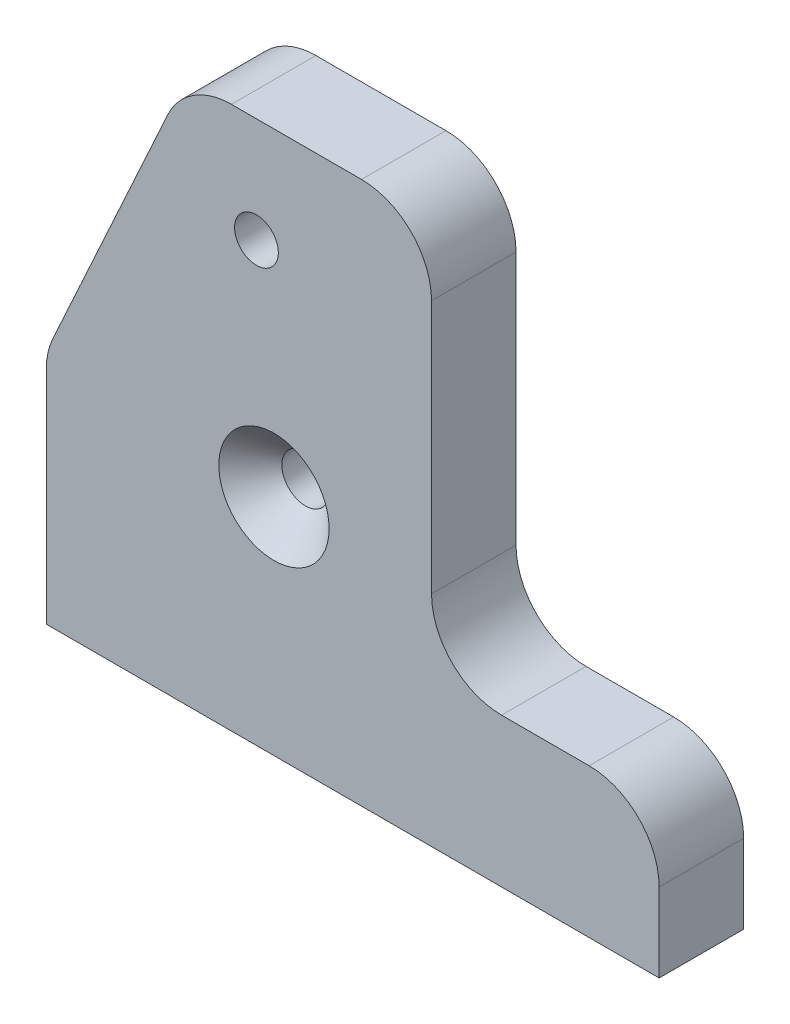
ISO-10303-21;
HEADER;
FILE_DESCRIPTION(('STEP AP214'),'2;1');
FILE_NAME('part.step','',(''),(''),'','','');
FILE_SCHEMA(('AUTOMOTIVE_DESIGN { 1 0 10303 214 1 1 1 1 }'));
ENDSEC;
DATA;
#1=APPLICATION_CONTEXT('core data for automotive mechanical design processes');
#2=APPLICATION_PROTOCOL_DEFINITION('international standard','automotive_design',2000,#1);
#3=PRODUCT_CONTEXT('',#1,'mechanical');
#4=PRODUCT('Part','Part','',(#3));
#5=PRODUCT_RELATED_PRODUCT_CATEGORY('part','',(#4));
#6=PRODUCT_DEFINITION_FORMATION('','',#4);
#7=PRODUCT_DEFINITION_CONTEXT('part definition',#1,'design');
#8=PRODUCT_DEFINITION('design','',#6,#7);
#9=PRODUCT_DEFINITION_SHAPE('','',#8);
#10=(LENGTH_UNIT() NAMED_UNIT(*) SI_UNIT(.MILLI.,.METRE.));
#11=(NAMED_UNIT(*) PLANE_ANGLE_UNIT() SI_UNIT($,.RADIAN.));
#12=(NAMED_UNIT(*) SI_UNIT($,.STERADIAN.) SOLID_ANGLE_UNIT());
#13=UNCERTAINTY_MEASURE_WITH_UNIT(LENGTH_MEASURE(1.E-05),#10,'distance_accuracy_value','');
#14=(GEOMETRIC_REPRESENTATION_CONTEXT(3) GLOBAL_UNCERTAINTY_ASSIGNED_CONTEXT((#13)) GLOBAL_UNIT_ASSIGNED_CONTEXT((#10,
#11,#12)) REPRESENTATION_CONTEXT('',''));
#15=CARTESIAN_POINT('',(0.,0.,0.));
#16=DIRECTION('',(0.,0.,1.));
#17=DIRECTION('',(1.,0.,0.));
#18=AXIS2_PLACEMENT_3D('',#15,#16,#17);
#19=CARTESIAN_POINT('',(0.,31.,4.826));
#20=DIRECTION('',(0.,1.,0.));
#21=DIRECTION('',(-1.,0.,0.));
#22=AXIS2_PLACEMENT_3D('',#19,#20,#21);
#23=PLANE('',#22);
#24=DIRECTION('',(1.,0.,0.));
#25=VECTOR('',#24,1.);
#26=CARTESIAN_POINT('',(0.,31.,0.));
#27=LINE('',#26,#25);
#28=CARTESIAN_POINT('',(10.5695728925472,31.,0.));
#29=VERTEX_POINT('',#28);
#30=CARTESIAN_POINT('',(18.,31.,0.));
#31=VERTEX_POINT('',#30);
#32=EDGE_CURVE('E180',#29,#31,#27,.T.);
#33=ORIENTED_EDGE('',*,*,#32,.F.);
#34=DIRECTION('',(0.,0.,-1.));
#35=VECTOR('',#34,1.);
#36=CARTESIAN_POINT('',(10.5695728925472,31.,4.826));
#37=LINE('',#36,#35);
#38=CARTESIAN_POINT('',(10.5695728925472,31.,4.826));
#39=VERTEX_POINT('',#38);
#40=EDGE_CURVE('E279',#29,#39,#37,.F.);
#41=ORIENTED_EDGE('',*,*,#40,.T.);
#42=DIRECTION('',(1.,0.,0.));
#43=VECTOR('',#42,1.);
#44=CARTESIAN_POINT('',(0.,31.,4.826));
#45=LINE('',#44,#43);
#46=CARTESIAN_POINT('',(18.,31.,4.826));
#47=VERTEX_POINT('',#46);
#48=EDGE_CURVE('E181',#39,#47,#45,.T.);
#49=ORIENTED_EDGE('',*,*,#48,.T.);
#50=DIRECTION('',(0.,0.,-1.));
#51=VECTOR('',#50,1.);
#52=CARTESIAN_POINT('',(18.,31.,4.826));
#53=LINE('',#52,#51);
#54=EDGE_CURVE('E275',#47,#31,#53,.T.);
#55=ORIENTED_EDGE('',*,*,#54,.T.);
#56=EDGE_LOOP('',(#33,#41,#49,#55));
#57=FACE_BOUND('',#56,.T.);
#58=ADVANCED_FACE('F51',(#57),#23,.T.);
#59=CARTESIAN_POINT('',(-5.10465901417961,2.33355840648211,4.826));
#60=DIRECTION('',(0.9094744755858,-0.415759760267795,0.));
#61=DIRECTION('',(0.415759760267795,0.9094744755858,0.));
#62=AXIS2_PLACEMENT_3D('',#59,#60,#61);
#63=PLANE('',#62);
#64=DIRECTION('',(-0.415759760267795,-0.9094744755858,0.));
#65=VECTOR('',#64,1.);
#66=CARTESIAN_POINT('',(-5.10465901417961,2.33355840648211,0.));
#67=LINE('',#66,#65);
#68=CARTESIAN_POINT('',(6.93167499020397,28.6630390410712,0.));
#69=VERTEX_POINT('',#68);
#70=CARTESIAN_POINT('',(0.3621020976568,14.2920983386242,0.));
#71=VERTEX_POINT('',#70);
#72=EDGE_CURVE('E212',#69,#71,#67,.T.);
#73=ORIENTED_EDGE('',*,*,#72,.T.);
#74=DIRECTION('',(0.,0.,-1.));
#75=VECTOR('',#74,1.);
#76=CARTESIAN_POINT('',(0.362102097656799,14.2920983386242,4.826));
#77=LINE('',#76,#75);
#78=CARTESIAN_POINT('',(0.3621020976568,14.2920983386242,4.826));
#79=VERTEX_POINT('',#78);
#80=EDGE_CURVE('E260',#71,#79,#77,.F.);
#81=ORIENTED_EDGE('',*,*,#80,.T.);
#82=DIRECTION('',(-0.415759760267795,-0.9094744755858,0.));
#83=VECTOR('',#82,1.);
#84=CARTESIAN_POINT('',(-5.10465901417961,2.33355840648211,4.826));
#85=LINE('',#84,#83);
#86=CARTESIAN_POINT('',(6.93167499020397,28.6630390410712,4.826));
#87=VERTEX_POINT('',#86);
#88=EDGE_CURVE('E185',#87,#79,#85,.T.);
#89=ORIENTED_EDGE('',*,*,#88,.F.);
#90=DIRECTION('',(0.,0.,-1.));
#91=VECTOR('',#90,1.);
#92=CARTESIAN_POINT('',(6.93167499020397,28.6630390410712,0.));
#93=LINE('',#92,#91);
#94=EDGE_CURVE('E256',#87,#69,#93,.T.);
#95=ORIENTED_EDGE('',*,*,#94,.T.);
#96=EDGE_LOOP('',(#73,#81,#89,#95));
#97=FACE_BOUND('',#96,.T.);
#98=ADVANCED_FACE('F324',(#97),#63,.F.);
#99=CARTESIAN_POINT('',(0.,0.,4.826));
#100=DIRECTION('',(-1.,0.,0.));
#101=DIRECTION('',(0.,0.,1.));
#102=AXIS2_PLACEMENT_3D('',#99,#100,#101);
#103=PLANE('',#102);
#104=DIRECTION('',(0.,1.,0.));
#105=VECTOR('',#104,1.);
#106=CARTESIAN_POINT('',(0.,0.,4.826));
#107=LINE('',#106,#105);
#108=CARTESIAN_POINT('',(0.,0.,4.826));
#109=VERTEX_POINT('',#108);
#110=CARTESIAN_POINT('',(0.,12.6290592975531,4.826));
#111=VERTEX_POINT('',#110);
#112=EDGE_CURVE('E190',#109,#111,#107,.T.);
#113=ORIENTED_EDGE('',*,*,#112,.T.);
#114=DIRECTION('',(0.,0.,-1.));
#115=VECTOR('',#114,1.);
#116=CARTESIAN_POINT('',(0.,12.6290592975531,0.));
#117=LINE('',#116,#115);
#118=CARTESIAN_POINT('',(0.,12.6290592975531,0.));
#119=VERTEX_POINT('',#118);
#120=EDGE_CURVE('E240',#111,#119,#117,.T.);
#121=ORIENTED_EDGE('',*,*,#120,.T.);
#122=DIRECTION('',(0.,1.,0.));
#123=VECTOR('',#122,1.);
#124=CARTESIAN_POINT('',(0.,0.,0.));
#125=LINE('',#124,#123);
#126=CARTESIAN_POINT('',(0.,0.,0.));
#127=VERTEX_POINT('',#126);
#128=EDGE_CURVE('E216',#127,#119,#125,.T.);
#129=ORIENTED_EDGE('',*,*,#128,.F.);
#130=DIRECTION('',(0.,0.,-1.));
#131=VECTOR('',#130,1.);
#132=CARTESIAN_POINT('',(0.,0.,4.826));
#133=LINE('',#132,#131);
#134=EDGE_CURVE('E237',#109,#127,#133,.T.);
#135=ORIENTED_EDGE('',*,*,#134,.F.);
#136=EDGE_LOOP('',(#113,#121,#129,#135));
#137=FACE_BOUND('',#136,.T.);
#138=ADVANCED_FACE('F333',(#137),#103,.T.);
#139=CARTESIAN_POINT('',(0.,0.,4.826));
#140=DIRECTION('',(0.,-1.,0.));
#141=DIRECTION('',(1.,0.,0.));
#142=AXIS2_PLACEMENT_3D('',#139,#140,#141);
#143=PLANE('',#142);
#144=CARTESIAN_POINT('',(16.73,0.,2.413));
#145=DIRECTION('',(0.,-1.,0.));
#146=DIRECTION('',(0.,0.,-1.));
#147=AXIS2_PLACEMENT_3D('',#144,#145,#146);
#148=CIRCLE('',#147,1.24999999999999);
#149=CARTESIAN_POINT('',(16.73,0.,1.16300000000001));
#150=VERTEX_POINT('',#149);
#151=EDGE_CURVE('E157',#150,#150,#148,.T.);
#152=ORIENTED_EDGE('',*,*,#151,.F.);
#153=EDGE_LOOP('',(#152));
#154=FACE_BOUND('',#153,.T.);
#155=CARTESIAN_POINT('',(28.73,0.,2.413));
#156=DIRECTION('',(0.,-1.,0.));
#157=DIRECTION('',(0.,0.,-1.));
#158=AXIS2_PLACEMENT_3D('',#155,#156,#157);
#159=CIRCLE('',#158,1.24999999999999);
#160=CARTESIAN_POINT('',(28.73,0.,1.16300000000001));
#161=VERTEX_POINT('',#160);
#162=EDGE_CURVE('E156',#161,#161,#159,.T.);
#163=ORIENTED_EDGE('',*,*,#162,.F.);
#164=EDGE_LOOP('',(#163));
#165=FACE_BOUND('',#164,.T.);
#166=DIRECTION('',(-1.,0.,0.));
#167=VECTOR('',#166,1.);
#168=CARTESIAN_POINT('',(0.,0.,0.));
#169=LINE('',#168,#167);
#170=CARTESIAN_POINT('',(35.,0.,0.));
#171=VERTEX_POINT('',#170);
#172=EDGE_CURVE('E220',#171,#127,#169,.T.);
#173=ORIENTED_EDGE('',*,*,#172,.F.);
#174=DIRECTION('',(0.,0.,-1.));
#175=VECTOR('',#174,1.);
#176=CARTESIAN_POINT('',(35.,0.,4.826));
#177=LINE('',#176,#175);
#178=CARTESIAN_POINT('',(35.,0.,4.826));
#179=VERTEX_POINT('',#178);
#180=EDGE_CURVE('E208',#179,#171,#177,.T.);
#181=ORIENTED_EDGE('',*,*,#180,.F.);
#182=DIRECTION('',(-1.,0.,0.));
#183=VECTOR('',#182,1.);
#184=CARTESIAN_POINT('',(0.,0.,4.826));
#185=LINE('',#184,#183);
#186=EDGE_CURVE('E194',#179,#109,#185,.T.);
#187=ORIENTED_EDGE('',*,*,#186,.T.);
#188=ORIENTED_EDGE('',*,*,#134,.T.);
#189=EDGE_LOOP('',(#173,#181,#187,#188));
#190=FACE_BOUND('',#189,.T.);
#191=ADVANCED_FACE('F338',(#154,#165,#190),#143,.T.);
#192=CARTESIAN_POINT('',(35.,0.,4.826));
#193=DIRECTION('',(1.,0.,0.));
#194=DIRECTION('',(0.,0.,-1.));
#195=AXIS2_PLACEMENT_3D('',#192,#193,#194);
#196=PLANE('',#195);
#197=DIRECTION('',(0.,-1.,0.));
#198=VECTOR('',#197,1.);
#199=CARTESIAN_POINT('',(35.,0.,0.));
#200=LINE('',#199,#198);
#201=CARTESIAN_POINT('',(35.,4.5,0.));
#202=VERTEX_POINT('',#201);
#203=EDGE_CURVE('E224',#202,#171,#200,.T.);
#204=ORIENTED_EDGE('',*,*,#203,.F.);
#205=DIRECTION('',(0.,0.,-1.));
#206=VECTOR('',#205,1.);
#207=CARTESIAN_POINT('',(35.,4.5,4.826));
#208=LINE('',#207,#206);
#209=CARTESIAN_POINT('',(35.,4.5,4.826));
#210=VERTEX_POINT('',#209);
#211=EDGE_CURVE('E289',#202,#210,#208,.F.);
#212=ORIENTED_EDGE('',*,*,#211,.T.);
#213=DIRECTION('',(0.,-1.,0.));
#214=VECTOR('',#213,1.);
#215=CARTESIAN_POINT('',(35.,0.,4.826));
#216=LINE('',#215,#214);
#217=EDGE_CURVE('E198',#210,#179,#216,.T.);
#218=ORIENTED_EDGE('',*,*,#217,.T.);
#219=ORIENTED_EDGE('',*,*,#180,.T.);
#220=EDGE_LOOP('',(#204,#212,#218,#219));
#221=FACE_BOUND('',#220,.T.);
#222=ADVANCED_FACE('F346',(#221),#196,.T.);
#223=CARTESIAN_POINT('',(0.,8.5,4.826));
#224=DIRECTION('',(0.,1.,0.));
#225=DIRECTION('',(0.,0.,1.));
#226=AXIS2_PLACEMENT_3D('',#223,#224,#225);
#227=PLANE('',#226);
#228=DIRECTION('',(1.,0.,0.));
#229=VECTOR('',#228,1.);
#230=CARTESIAN_POINT('',(0.,8.5,4.826));
#231=LINE('',#230,#229);
#232=CARTESIAN_POINT('',(26.,8.5,4.826));
#233=VERTEX_POINT('',#232);
#234=CARTESIAN_POINT('',(31.,8.5,4.826));
#235=VERTEX_POINT('',#234);
#236=EDGE_CURVE('E201',#233,#235,#231,.T.);
#237=ORIENTED_EDGE('',*,*,#236,.T.);
#238=DIRECTION('',(0.,0.,-1.));
#239=VECTOR('',#238,1.);
#240=CARTESIAN_POINT('',(31.,8.5,4.826));
#241=LINE('',#240,#239);
#242=CARTESIAN_POINT('',(31.,8.5,0.));
#243=VERTEX_POINT('',#242);
#244=EDGE_CURVE('E285',#235,#243,#241,.T.);
#245=ORIENTED_EDGE('',*,*,#244,.T.);
#246=DIRECTION('',(1.,0.,0.));
#247=VECTOR('',#246,1.);
#248=CARTESIAN_POINT('',(0.,8.5,0.));
#249=LINE('',#248,#247);
#250=CARTESIAN_POINT('',(26.,8.5,0.));
#251=VERTEX_POINT('',#250);
#252=EDGE_CURVE('E227',#251,#243,#249,.T.);
#253=ORIENTED_EDGE('',*,*,#252,.F.);
#254=DIRECTION('',(0.,0.,-1.));
#255=VECTOR('',#254,1.);
#256=CARTESIAN_POINT('',(26.,8.5,4.826));
#257=LINE('',#256,#255);
#258=EDGE_CURVE('E282',#251,#233,#257,.F.);
#259=ORIENTED_EDGE('',*,*,#258,.T.);
#260=EDGE_LOOP('',(#237,#245,#253,#259));
#261=FACE_BOUND('',#260,.T.);
#262=ADVANCED_FACE('F305',(#261),#227,.T.);
#263=CARTESIAN_POINT('',(22.,0.,4.826));
#264=DIRECTION('',(1.,0.,0.));
#265=DIRECTION('',(0.,1.,0.));
#266=AXIS2_PLACEMENT_3D('',#263,#264,#265);
#267=PLANE('',#266);
#268=DIRECTION('',(0.,-1.,0.));
#269=VECTOR('',#268,1.);
#270=CARTESIAN_POINT('',(22.,0.,4.826));
#271=LINE('',#270,#269);
#272=CARTESIAN_POINT('',(22.,27.,4.826));
#273=VERTEX_POINT('',#272);
#274=CARTESIAN_POINT('',(22.,12.5,4.826));
#275=VERTEX_POINT('',#274);
#276=EDGE_CURVE('E205',#273,#275,#271,.T.);
#277=ORIENTED_EDGE('',*,*,#276,.T.);
#278=DIRECTION('',(0.,0.,-1.));
#279=VECTOR('',#278,1.);
#280=CARTESIAN_POINT('',(22.,12.5,0.));
#281=LINE('',#280,#279);
#282=CARTESIAN_POINT('',(22.,12.5,0.));
#283=VERTEX_POINT('',#282);
#284=EDGE_CURVE('E294',#275,#283,#281,.T.);
#285=ORIENTED_EDGE('',*,*,#284,.T.);
#286=DIRECTION('',(0.,-1.,0.));
#287=VECTOR('',#286,1.);
#288=CARTESIAN_POINT('',(22.,0.,0.));
#289=LINE('',#288,#287);
#290=CARTESIAN_POINT('',(22.,27.,0.));
#291=VERTEX_POINT('',#290);
#292=EDGE_CURVE('E186',#291,#283,#289,.T.);
#293=ORIENTED_EDGE('',*,*,#292,.F.);
#294=DIRECTION('',(0.,0.,-1.));
#295=VECTOR('',#294,1.);
#296=CARTESIAN_POINT('',(22.,27.,4.826));
#297=LINE('',#296,#295);
#298=EDGE_CURVE('E72',#291,#273,#297,.F.);
#299=ORIENTED_EDGE('',*,*,#298,.T.);
#300=EDGE_LOOP('',(#277,#285,#293,#299));
#301=FACE_BOUND('',#300,.T.);
#302=ADVANCED_FACE('F308',(#301),#267,.T.);
#303=CARTESIAN_POINT('',(0.,0.,4.826));
#304=DIRECTION('',(0.,0.,1.));
#305=DIRECTION('',(1.,0.,0.));
#306=AXIS2_PLACEMENT_3D('',#303,#304,#305);
#307=PLANE('',#306);
#308=CARTESIAN_POINT('',(13.,12.8,4.826));
#309=DIRECTION('',(0.,0.,1.));
#310=DIRECTION('',(1.,0.,0.));
#311=AXIS2_PLACEMENT_3D('',#308,#309,#310);
#312=CIRCLE('',#311,3.15);
#313=CARTESIAN_POINT('',(16.15,12.8,4.826));
#314=VERTEX_POINT('',#313);
#315=EDGE_CURVE('E618',#314,#314,#312,.T.);
#316=ORIENTED_EDGE('',*,*,#315,.F.);
#317=EDGE_LOOP('',(#316));
#318=FACE_BOUND('',#317,.T.);
#319=CARTESIAN_POINT('',(12.,25.,4.826));
#320=DIRECTION('',(0.,0.,1.));
#321=DIRECTION('',(1.,0.,0.));
#322=AXIS2_PLACEMENT_3D('',#319,#320,#321);
#323=CIRCLE('',#322,1.24999999999999);
#324=CARTESIAN_POINT('',(13.25,25.,4.826));
#325=VERTEX_POINT('',#324);
#326=EDGE_CURVE('E172',#325,#325,#323,.T.);
#327=ORIENTED_EDGE('',*,*,#326,.F.);
#328=EDGE_LOOP('',(#327));
#329=FACE_BOUND('',#328,.T.);
#330=ORIENTED_EDGE('',*,*,#88,.T.);
#331=CARTESIAN_POINT('',(4.,12.6290592975531,4.826));
#332=DIRECTION('',(0.,0.,1.));
#333=DIRECTION('',(1.,0.,0.));
#334=AXIS2_PLACEMENT_3D('',#331,#332,#333);
#335=CIRCLE('',#334,4.);
#336=EDGE_CURVE('E272',#79,#111,#335,.T.);
#337=ORIENTED_EDGE('',*,*,#336,.T.);
#338=ORIENTED_EDGE('',*,*,#112,.F.);
#339=ORIENTED_EDGE('',*,*,#186,.F.);
#340=ORIENTED_EDGE('',*,*,#217,.F.);
#341=CARTESIAN_POINT('',(31.,4.5,4.826));
#342=DIRECTION('',(0.,0.,1.));
#343=DIRECTION('',(1.,0.,0.));
#344=AXIS2_PLACEMENT_3D('',#341,#342,#343);
#345=CIRCLE('',#344,4.);
#346=EDGE_CURVE('E266',#210,#235,#345,.T.);
#347=ORIENTED_EDGE('',*,*,#346,.T.);
#348=ORIENTED_EDGE('',*,*,#236,.F.);
#349=CARTESIAN_POINT('',(26.,12.5,4.826));
#350=DIRECTION('',(0.,0.,1.));
#351=DIRECTION('',(1.,0.,0.));
#352=AXIS2_PLACEMENT_3D('',#349,#350,#351);
#353=CIRCLE('',#352,4.);
#354=EDGE_CURVE('E11',#233,#275,#353,.F.);
#355=ORIENTED_EDGE('',*,*,#354,.T.);
#356=ORIENTED_EDGE('',*,*,#276,.F.);
#357=CARTESIAN_POINT('',(18.,27.,4.826));
#358=DIRECTION('',(0.,0.,1.));
#359=DIRECTION('',(1.,0.,0.));
#360=AXIS2_PLACEMENT_3D('',#357,#358,#359);
#361=CIRCLE('',#360,4.);
#362=EDGE_CURVE('E263',#273,#47,#361,.T.);
#363=ORIENTED_EDGE('',*,*,#362,.T.);
#364=ORIENTED_EDGE('',*,*,#48,.F.);
#365=CARTESIAN_POINT('',(10.5695728925472,27.,4.826));
#366=DIRECTION('',(0.,0.,1.));
#367=DIRECTION('',(1.,0.,0.));
#368=AXIS2_PLACEMENT_3D('',#365,#366,#367);
#369=CIRCLE('',#368,4.);
#370=EDGE_CURVE('E269',#39,#87,#369,.T.);
#371=ORIENTED_EDGE('',*,*,#370,.T.);
#372=EDGE_LOOP('',(#330,#337,#338,#339,#340,#347,#348,#355,#356,#363,#364,#371));
#373=FACE_BOUND('',#372,.T.);
#374=ADVANCED_FACE('F310',(#318,#329,#373),#307,.T.);
#375=CARTESIAN_POINT('',(0.,0.,0.));
#376=DIRECTION('',(0.,0.,1.));
#377=DIRECTION('',(1.,0.,0.));
#378=AXIS2_PLACEMENT_3D('',#375,#376,#377);
#379=PLANE('',#378);
#380=CARTESIAN_POINT('',(13.,12.8,0.));
#381=DIRECTION('',(0.,0.,1.));
#382=DIRECTION('',(1.,0.,0.));
#383=AXIS2_PLACEMENT_3D('',#380,#381,#382);
#384=CIRCLE('',#383,1.35);
#385=CARTESIAN_POINT('',(14.35,12.8,0.));
#386=VERTEX_POINT('',#385);
#387=EDGE_CURVE('E165',#386,#386,#384,.T.);
#388=ORIENTED_EDGE('',*,*,#387,.T.);
#389=EDGE_LOOP('',(#388));
#390=FACE_BOUND('',#389,.T.);
#391=CARTESIAN_POINT('',(12.,25.,0.));
#392=DIRECTION('',(0.,0.,1.));
#393=DIRECTION('',(1.,0.,0.));
#394=AXIS2_PLACEMENT_3D('',#391,#392,#393);
#395=CIRCLE('',#394,1.25);
#396=CARTESIAN_POINT('',(13.25,25.,0.));
#397=VERTEX_POINT('',#396);
#398=EDGE_CURVE('E176',#397,#397,#395,.T.);
#399=ORIENTED_EDGE('',*,*,#398,.T.);
#400=EDGE_LOOP('',(#399));
#401=FACE_BOUND('',#400,.T.);
#402=ORIENTED_EDGE('',*,*,#128,.T.);
#403=CARTESIAN_POINT('',(4.,12.6290592975531,0.));
#404=DIRECTION('',(0.,0.,1.));
#405=DIRECTION('',(1.,0.,0.));
#406=AXIS2_PLACEMENT_3D('',#403,#404,#405);
#407=CIRCLE('',#406,4.);
#408=EDGE_CURVE('E253',#119,#71,#407,.F.);
#409=ORIENTED_EDGE('',*,*,#408,.T.);
#410=ORIENTED_EDGE('',*,*,#72,.F.);
#411=CARTESIAN_POINT('',(10.5695728925472,27.,0.));
#412=DIRECTION('',(0.,0.,1.));
#413=DIRECTION('',(1.,0.,0.));
#414=AXIS2_PLACEMENT_3D('',#411,#412,#413);
#415=CIRCLE('',#414,4.);
#416=EDGE_CURVE('E250',#69,#29,#415,.F.);
#417=ORIENTED_EDGE('',*,*,#416,.T.);
#418=ORIENTED_EDGE('',*,*,#32,.T.);
#419=CARTESIAN_POINT('',(18.,27.,0.));
#420=DIRECTION('',(0.,0.,1.));
#421=DIRECTION('',(1.,0.,0.));
#422=AXIS2_PLACEMENT_3D('',#419,#420,#421);
#423=CIRCLE('',#422,4.);
#424=EDGE_CURVE('E244',#31,#291,#423,.F.);
#425=ORIENTED_EDGE('',*,*,#424,.T.);
#426=ORIENTED_EDGE('',*,*,#292,.T.);
#427=CARTESIAN_POINT('',(26.,12.5,0.));
#428=DIRECTION('',(0.,0.,1.));
#429=DIRECTION('',(1.,0.,0.));
#430=AXIS2_PLACEMENT_3D('',#427,#428,#429);
#431=CIRCLE('',#430,4.);
#432=EDGE_CURVE('E60',#283,#251,#431,.T.);
#433=ORIENTED_EDGE('',*,*,#432,.T.);
#434=ORIENTED_EDGE('',*,*,#252,.T.);
#435=CARTESIAN_POINT('',(31.,4.5,0.));
#436=DIRECTION('',(0.,0.,1.));
#437=DIRECTION('',(1.,0.,0.));
#438=AXIS2_PLACEMENT_3D('',#435,#436,#437);
#439=CIRCLE('',#438,4.);
#440=EDGE_CURVE('E247',#243,#202,#439,.F.);
#441=ORIENTED_EDGE('',*,*,#440,.T.);
#442=ORIENTED_EDGE('',*,*,#203,.T.);
#443=ORIENTED_EDGE('',*,*,#172,.T.);
#444=EDGE_LOOP('',(#402,#409,#410,#417,#418,#425,#426,#433,#434,#441,#442,#443));
#445=FACE_BOUND('',#444,.T.);
#446=ADVANCED_FACE('F300',(#390,#401,#445),#379,.F.);
#447=CARTESIAN_POINT('',(12.,25.,4.826));
#448=DIRECTION('',(0.,0.,1.));
#449=DIRECTION('',(1.,0.,0.));
#450=AXIS2_PLACEMENT_3D('',#447,#448,#449);
#451=CYLINDRICAL_SURFACE('',#450,1.24999999999999);
#452=ORIENTED_EDGE('',*,*,#398,.F.);
#453=EDGE_LOOP('',(#452));
#454=FACE_BOUND('',#453,.T.);
#455=ORIENTED_EDGE('',*,*,#326,.T.);
#456=EDGE_LOOP('',(#455));
#457=FACE_BOUND('',#456,.T.);
#458=ADVANCED_FACE('F396',(#454,#457),#451,.F.);
#459=CARTESIAN_POINT('',(28.73,5.,2.413));
#460=DIRECTION('',(0.,-1.,0.));
#461=DIRECTION('',(0.,0.,-1.));
#462=AXIS2_PLACEMENT_3D('',#459,#460,#461);
#463=CONICAL_SURFACE('',#462,1.25,1.02974425867665);
#464=CARTESIAN_POINT('',(28.73,5.75107577378445,2.413));
#465=VERTEX_POINT('',#464);
#466=VERTEX_LOOP('',#465);
#467=FACE_BOUND('',#466,.T.);
#468=CARTESIAN_POINT('',(28.73,5.,2.413));
#469=DIRECTION('',(0.,-1.,0.));
#470=DIRECTION('',(0.,0.,-1.));
#471=AXIS2_PLACEMENT_3D('',#468,#469,#470);
#472=CIRCLE('',#471,1.25);
#473=CARTESIAN_POINT('',(28.73,5.,1.163));
#474=VERTEX_POINT('',#473);
#475=EDGE_CURVE('E162',#474,#474,#472,.T.);
#476=ORIENTED_EDGE('',*,*,#475,.T.);
#477=EDGE_LOOP('',(#476));
#478=FACE_BOUND('',#477,.T.);
#479=ADVANCED_FACE('F392',(#467,#478),#463,.F.);
#480=CARTESIAN_POINT('',(28.73,0.,2.413));
#481=DIRECTION('',(0.,-1.,0.));
#482=DIRECTION('',(0.,0.,-1.));
#483=AXIS2_PLACEMENT_3D('',#480,#481,#482);
#484=CYLINDRICAL_SURFACE('',#483,1.24999999999999);
#485=ORIENTED_EDGE('',*,*,#475,.F.);
#486=EDGE_LOOP('',(#485));
#487=FACE_BOUND('',#486,.T.);
#488=ORIENTED_EDGE('',*,*,#162,.T.);
#489=EDGE_LOOP('',(#488));
#490=FACE_BOUND('',#489,.T.);
#491=ADVANCED_FACE('F149',(#487,#490),#484,.F.);
#492=CARTESIAN_POINT('',(16.73,5.,2.413));
#493=DIRECTION('',(0.,-1.,0.));
#494=DIRECTION('',(0.,0.,-1.));
#495=AXIS2_PLACEMENT_3D('',#492,#493,#494);
#496=CONICAL_SURFACE('',#495,1.25,1.02974425867665);
#497=CARTESIAN_POINT('',(16.73,5.75107577378445,2.413));
#498=VERTEX_POINT('',#497);
#499=VERTEX_LOOP('',#498);
#500=FACE_BOUND('',#499,.T.);
#501=CARTESIAN_POINT('',(16.73,5.,2.413));
#502=DIRECTION('',(0.,-1.,0.));
#503=DIRECTION('',(0.,0.,-1.));
#504=AXIS2_PLACEMENT_3D('',#501,#502,#503);
#505=CIRCLE('',#504,1.25);
#506=CARTESIAN_POINT('',(16.73,5.,1.163));
#507=VERTEX_POINT('',#506);
#508=EDGE_CURVE('E153',#507,#507,#505,.T.);
#509=ORIENTED_EDGE('',*,*,#508,.T.);
#510=EDGE_LOOP('',(#509));
#511=FACE_BOUND('',#510,.T.);
#512=ADVANCED_FACE('F145',(#500,#511),#496,.F.);
#513=CARTESIAN_POINT('',(16.73,0.,2.413));
#514=DIRECTION('',(0.,-1.,0.));
#515=DIRECTION('',(0.,0.,-1.));
#516=AXIS2_PLACEMENT_3D('',#513,#514,#515);
#517=CYLINDRICAL_SURFACE('',#516,1.24999999999999);
#518=ORIENTED_EDGE('',*,*,#508,.F.);
#519=EDGE_LOOP('',(#518));
#520=FACE_BOUND('',#519,.T.);
#521=ORIENTED_EDGE('',*,*,#151,.T.);
#522=EDGE_LOOP('',(#521));
#523=FACE_BOUND('',#522,.T.);
#524=ADVANCED_FACE('F148',(#520,#523),#517,.F.);
#525=CARTESIAN_POINT('',(4.,12.6290592975531,4.826));
#526=DIRECTION('',(0.,0.,1.));
#527=DIRECTION('',(1.,0.,0.));
#528=AXIS2_PLACEMENT_3D('',#525,#526,#527);
#529=CYLINDRICAL_SURFACE('',#528,4.);
#530=ORIENTED_EDGE('',*,*,#336,.F.);
#531=ORIENTED_EDGE('',*,*,#80,.F.);
#532=ORIENTED_EDGE('',*,*,#408,.F.);
#533=ORIENTED_EDGE('',*,*,#120,.F.);
#534=EDGE_LOOP('',(#530,#531,#532,#533));
#535=FACE_BOUND('',#534,.T.);
#536=ADVANCED_FACE('F330',(#535),#529,.T.);
#537=CARTESIAN_POINT('',(10.5695728925472,27.,4.826));
#538=DIRECTION('',(0.,0.,1.));
#539=DIRECTION('',(1.,0.,0.));
#540=AXIS2_PLACEMENT_3D('',#537,#538,#539);
#541=CYLINDRICAL_SURFACE('',#540,4.);
#542=ORIENTED_EDGE('',*,*,#370,.F.);
#543=ORIENTED_EDGE('',*,*,#40,.F.);
#544=ORIENTED_EDGE('',*,*,#416,.F.);
#545=ORIENTED_EDGE('',*,*,#94,.F.);
#546=EDGE_LOOP('',(#542,#543,#544,#545));
#547=FACE_BOUND('',#546,.T.);
#548=ADVANCED_FACE('F321',(#547),#541,.T.);
#549=CARTESIAN_POINT('',(31.,4.5,4.826));
#550=DIRECTION('',(0.,0.,-1.));
#551=DIRECTION('',(-1.,0.,0.));
#552=AXIS2_PLACEMENT_3D('',#549,#550,#551);
#553=CYLINDRICAL_SURFACE('',#552,4.);
#554=ORIENTED_EDGE('',*,*,#346,.F.);
#555=ORIENTED_EDGE('',*,*,#211,.F.);
#556=ORIENTED_EDGE('',*,*,#440,.F.);
#557=ORIENTED_EDGE('',*,*,#244,.F.);
#558=EDGE_LOOP('',(#554,#555,#556,#557));
#559=FACE_BOUND('',#558,.T.);
#560=ADVANCED_FACE('F345',(#559),#553,.T.);
#561=CARTESIAN_POINT('',(26.,12.5,4.826));
#562=DIRECTION('',(0.,0.,1.));
#563=DIRECTION('',(1.,0.,0.));
#564=AXIS2_PLACEMENT_3D('',#561,#562,#563);
#565=CYLINDRICAL_SURFACE('',#564,4.);
#566=ORIENTED_EDGE('',*,*,#354,.F.);
#567=ORIENTED_EDGE('',*,*,#258,.F.);
#568=ORIENTED_EDGE('',*,*,#432,.F.);
#569=ORIENTED_EDGE('',*,*,#284,.F.);
#570=EDGE_LOOP('',(#566,#567,#568,#569));
#571=FACE_BOUND('',#570,.T.);
#572=ADVANCED_FACE('F307',(#571),#565,.F.);
#573=CARTESIAN_POINT('',(18.,27.,4.826));
#574=DIRECTION('',(0.,0.,-1.));
#575=DIRECTION('',(-1.,0.,0.));
#576=AXIS2_PLACEMENT_3D('',#573,#574,#575);
#577=CYLINDRICAL_SURFACE('',#576,4.);
#578=ORIENTED_EDGE('',*,*,#362,.F.);
#579=ORIENTED_EDGE('',*,*,#298,.F.);
#580=ORIENTED_EDGE('',*,*,#424,.F.);
#581=ORIENTED_EDGE('',*,*,#54,.F.);
#582=EDGE_LOOP('',(#578,#579,#580,#581));
#583=FACE_BOUND('',#582,.T.);
#584=ADVANCED_FACE('F53',(#583),#577,.T.);
#585=CARTESIAN_POINT('',(13.,12.8,4.826));
#586=DIRECTION('',(0.,0.,1.));
#587=DIRECTION('',(1.,0.,0.));
#588=AXIS2_PLACEMENT_3D('',#585,#586,#587);
#589=CYLINDRICAL_SURFACE('',#588,1.35);
#590=ORIENTED_EDGE('',*,*,#387,.F.);
#591=EDGE_LOOP('',(#590));
#592=FACE_BOUND('',#591,.T.);
#593=CARTESIAN_POINT('',(13.,12.8,3.026));
#594=DIRECTION('',(0.,0.,1.));
#595=DIRECTION('',(1.,0.,0.));
#596=AXIS2_PLACEMENT_3D('',#593,#594,#595);
#597=CIRCLE('',#596,1.35);
#598=CARTESIAN_POINT('',(14.35,12.8,3.026));
#599=VERTEX_POINT('',#598);
#600=EDGE_CURVE('E615',#599,#599,#597,.T.);
#601=ORIENTED_EDGE('',*,*,#600,.T.);
#602=EDGE_LOOP('',(#601));
#603=FACE_BOUND('',#602,.T.);
#604=ADVANCED_FACE('F373',(#592,#603),#589,.F.);
#605=CARTESIAN_POINT('',(13.,12.8,4.826));
#606=DIRECTION('',(0.,0.,1.));
#607=DIRECTION('',(1.,0.,0.));
#608=AXIS2_PLACEMENT_3D('',#605,#606,#607);
#609=CONICAL_SURFACE('',#608,3.15,0.785398163397448);
#610=ORIENTED_EDGE('',*,*,#600,.F.);
#611=EDGE_LOOP('',(#610));
#612=FACE_BOUND('',#611,.T.);
#613=ORIENTED_EDGE('',*,*,#315,.T.);
#614=EDGE_LOOP('',(#613));
#615=FACE_BOUND('',#614,.T.);
#616=ADVANCED_FACE('F377',(#612,#615),#609,.F.);
#617=CLOSED_SHELL('',(#58,#98,#138,#191,#222,#262,#302,#374,#446,#458,#479,#491,#512,#524,#536,
#548,#560,#572,#584,#604,#616));
#618=MANIFOLD_SOLID_BREP('B2',#617);
#619=ADVANCED_BREP_SHAPE_REPRESENTATION('',(#18,#618),#14);
#620=SHAPE_DEFINITION_REPRESENTATION(#9,#619);
ENDSEC;
END-ISO-10303-21;
